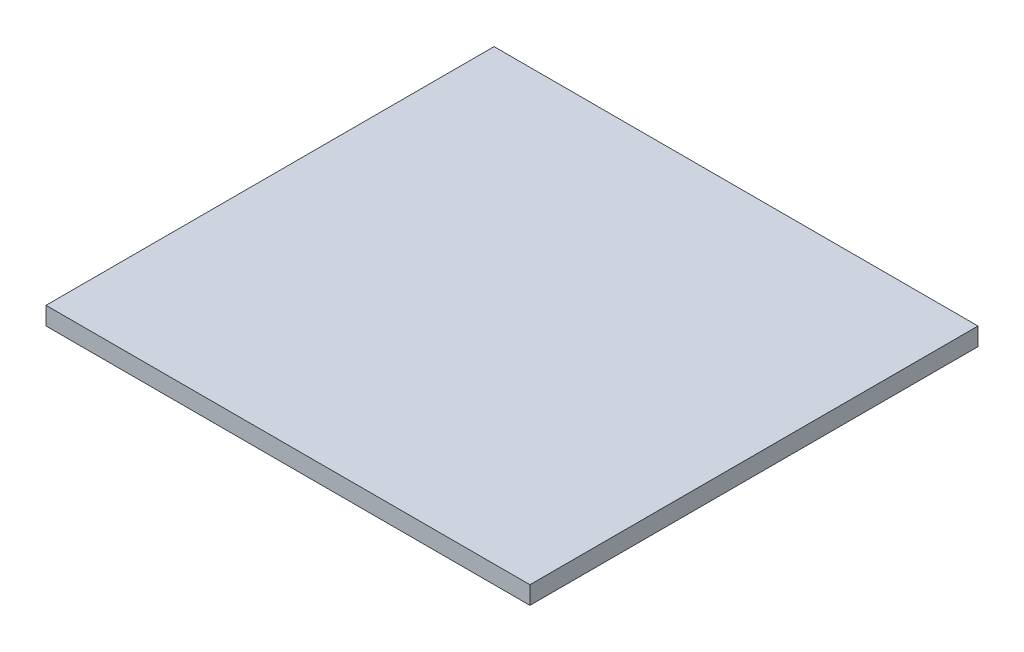
ISO-10303-21;
HEADER;
FILE_DESCRIPTION(('STEP AP214'),'2;1');
FILE_NAME('part.step','',(''),(''),'','','');
FILE_SCHEMA(('AUTOMOTIVE_DESIGN { 1 0 10303 214 1 1 1 1 }'));
ENDSEC;
DATA;
#1=APPLICATION_CONTEXT('core data for automotive mechanical design processes');
#2=APPLICATION_PROTOCOL_DEFINITION('international standard','automotive_design',2000,#1);
#3=PRODUCT_CONTEXT('',#1,'mechanical');
#4=PRODUCT('Part','Part','',(#3));
#5=PRODUCT_RELATED_PRODUCT_CATEGORY('part','',(#4));
#6=PRODUCT_DEFINITION_FORMATION('','',#4);
#7=PRODUCT_DEFINITION_CONTEXT('part definition',#1,'design');
#8=PRODUCT_DEFINITION('design','',#6,#7);
#9=PRODUCT_DEFINITION_SHAPE('','',#8);
#10=(LENGTH_UNIT() NAMED_UNIT(*) SI_UNIT(.MILLI.,.METRE.));
#11=(NAMED_UNIT(*) PLANE_ANGLE_UNIT() SI_UNIT($,.RADIAN.));
#12=(NAMED_UNIT(*) SI_UNIT($,.STERADIAN.) SOLID_ANGLE_UNIT());
#13=UNCERTAINTY_MEASURE_WITH_UNIT(LENGTH_MEASURE(1.E-05),#10,'distance_accuracy_value','');
#14=(GEOMETRIC_REPRESENTATION_CONTEXT(3) GLOBAL_UNCERTAINTY_ASSIGNED_CONTEXT((#13)) GLOBAL_UNIT_ASSIGNED_CONTEXT((#10,
#11,#12)) REPRESENTATION_CONTEXT('',''));
#15=CARTESIAN_POINT('',(0.,0.,0.));
#16=DIRECTION('',(0.,0.,1.));
#17=DIRECTION('',(1.,0.,0.));
#18=AXIS2_PLACEMENT_3D('',#15,#16,#17);
#19=CARTESIAN_POINT('',(0.,2.,0.));
#20=DIRECTION('',(1.,0.,0.));
#21=DIRECTION('',(0.,0.,-1.));
#22=AXIS2_PLACEMENT_3D('',#19,#20,#21);
#23=PLANE('',#22);
#24=DIRECTION('',(0.,0.,1.));
#25=VECTOR('',#24,1.);
#26=CARTESIAN_POINT('',(0.,0.,0.));
#27=LINE('',#26,#25);
#28=CARTESIAN_POINT('',(0.,0.,-50.));
#29=VERTEX_POINT('',#28);
#30=CARTESIAN_POINT('',(0.,0.,0.));
#31=VERTEX_POINT('',#30);
#32=EDGE_CURVE('E96',#29,#31,#27,.T.);
#33=ORIENTED_EDGE('',*,*,#32,.T.);
#34=DIRECTION('',(0.,-1.,0.));
#35=VECTOR('',#34,1.);
#36=CARTESIAN_POINT('',(0.,2.,0.));
#37=LINE('',#36,#35);
#38=CARTESIAN_POINT('',(0.,2.,0.));
#39=VERTEX_POINT('',#38);
#40=EDGE_CURVE('E11',#39,#31,#37,.T.);
#41=ORIENTED_EDGE('',*,*,#40,.F.);
#42=DIRECTION('',(0.,0.,1.));
#43=VECTOR('',#42,1.);
#44=CARTESIAN_POINT('',(0.,2.,0.));
#45=LINE('',#44,#43);
#46=CARTESIAN_POINT('',(0.,2.,-50.));
#47=VERTEX_POINT('',#46);
#48=EDGE_CURVE('E84',#47,#39,#45,.T.);
#49=ORIENTED_EDGE('',*,*,#48,.F.);
#50=DIRECTION('',(0.,-1.,0.));
#51=VECTOR('',#50,1.);
#52=CARTESIAN_POINT('',(0.,2.,-50.));
#53=LINE('',#52,#51);
#54=EDGE_CURVE('E92',#47,#29,#53,.T.);
#55=ORIENTED_EDGE('',*,*,#54,.T.);
#56=EDGE_LOOP('',(#33,#41,#49,#55));
#57=FACE_BOUND('',#56,.T.);
#58=ADVANCED_FACE('F33',(#57),#23,.F.);
#59=CARTESIAN_POINT('',(0.,2.,0.));
#60=DIRECTION('',(0.,0.,-1.));
#61=DIRECTION('',(-1.,0.,0.));
#62=AXIS2_PLACEMENT_3D('',#59,#60,#61);
#63=PLANE('',#62);
#64=DIRECTION('',(1.,0.,0.));
#65=VECTOR('',#64,1.);
#66=CARTESIAN_POINT('',(0.,0.,0.));
#67=LINE('',#66,#65);
#68=CARTESIAN_POINT('',(54.,0.,0.));
#69=VERTEX_POINT('',#68);
#70=EDGE_CURVE('E88',#31,#69,#67,.T.);
#71=ORIENTED_EDGE('',*,*,#70,.T.);
#72=DIRECTION('',(0.,-1.,0.));
#73=VECTOR('',#72,1.);
#74=CARTESIAN_POINT('',(54.,2.,0.));
#75=LINE('',#74,#73);
#76=CARTESIAN_POINT('',(54.,2.,0.));
#77=VERTEX_POINT('',#76);
#78=EDGE_CURVE('E41',#77,#69,#75,.T.);
#79=ORIENTED_EDGE('',*,*,#78,.F.);
#80=DIRECTION('',(1.,0.,0.));
#81=VECTOR('',#80,1.);
#82=CARTESIAN_POINT('',(0.,2.,0.));
#83=LINE('',#82,#81);
#84=EDGE_CURVE('E79',#39,#77,#83,.T.);
#85=ORIENTED_EDGE('',*,*,#84,.F.);
#86=ORIENTED_EDGE('',*,*,#40,.T.);
#87=EDGE_LOOP('',(#71,#79,#85,#86));
#88=FACE_BOUND('',#87,.T.);
#89=ADVANCED_FACE('F87',(#88),#63,.F.);
#90=CARTESIAN_POINT('',(54.,2.,0.));
#91=DIRECTION('',(-1.,0.,0.));
#92=DIRECTION('',(0.,0.,1.));
#93=AXIS2_PLACEMENT_3D('',#90,#91,#92);
#94=PLANE('',#93);
#95=DIRECTION('',(0.,0.,-1.));
#96=VECTOR('',#95,1.);
#97=CARTESIAN_POINT('',(54.,0.,0.));
#98=LINE('',#97,#96);
#99=CARTESIAN_POINT('',(54.,0.,-50.));
#100=VERTEX_POINT('',#99);
#101=EDGE_CURVE('E66',#69,#100,#98,.T.);
#102=ORIENTED_EDGE('',*,*,#101,.T.);
#103=DIRECTION('',(0.,-1.,0.));
#104=VECTOR('',#103,1.);
#105=CARTESIAN_POINT('',(54.,2.,-50.));
#106=LINE('',#105,#104);
#107=CARTESIAN_POINT('',(54.,2.,-50.));
#108=VERTEX_POINT('',#107);
#109=EDGE_CURVE('E89',#108,#100,#106,.T.);
#110=ORIENTED_EDGE('',*,*,#109,.F.);
#111=DIRECTION('',(0.,0.,-1.));
#112=VECTOR('',#111,1.);
#113=CARTESIAN_POINT('',(54.,2.,0.));
#114=LINE('',#113,#112);
#115=EDGE_CURVE('E82',#77,#108,#114,.T.);
#116=ORIENTED_EDGE('',*,*,#115,.F.);
#117=ORIENTED_EDGE('',*,*,#78,.T.);
#118=EDGE_LOOP('',(#102,#110,#116,#117));
#119=FACE_BOUND('',#118,.T.);
#120=ADVANCED_FACE('F90',(#119),#94,.F.);
#121=CARTESIAN_POINT('',(0.,2.,-50.));
#122=DIRECTION('',(0.,0.,1.));
#123=DIRECTION('',(1.,0.,0.));
#124=AXIS2_PLACEMENT_3D('',#121,#122,#123);
#125=PLANE('',#124);
#126=DIRECTION('',(-1.,0.,0.));
#127=VECTOR('',#126,1.);
#128=CARTESIAN_POINT('',(0.,0.,-50.));
#129=LINE('',#128,#127);
#130=EDGE_CURVE('E72',#100,#29,#129,.T.);
#131=ORIENTED_EDGE('',*,*,#130,.T.);
#132=ORIENTED_EDGE('',*,*,#54,.F.);
#133=DIRECTION('',(-1.,0.,0.));
#134=VECTOR('',#133,1.);
#135=CARTESIAN_POINT('',(0.,2.,-50.));
#136=LINE('',#135,#134);
#137=EDGE_CURVE('E49',#108,#47,#136,.T.);
#138=ORIENTED_EDGE('',*,*,#137,.F.);
#139=ORIENTED_EDGE('',*,*,#109,.T.);
#140=EDGE_LOOP('',(#131,#132,#138,#139));
#141=FACE_BOUND('',#140,.T.);
#142=ADVANCED_FACE('F103',(#141),#125,.F.);
#143=CARTESIAN_POINT('',(0.,2.,0.));
#144=DIRECTION('',(0.,-1.,0.));
#145=DIRECTION('',(0.,0.,-1.));
#146=AXIS2_PLACEMENT_3D('',#143,#144,#145);
#147=PLANE('',#146);
#148=ORIENTED_EDGE('',*,*,#48,.T.);
#149=ORIENTED_EDGE('',*,*,#84,.T.);
#150=ORIENTED_EDGE('',*,*,#115,.T.);
#151=ORIENTED_EDGE('',*,*,#137,.T.);
#152=EDGE_LOOP('',(#148,#149,#150,#151));
#153=FACE_BOUND('',#152,.T.);
#154=ADVANCED_FACE('F80',(#153),#147,.F.);
#155=CARTESIAN_POINT('',(0.,0.,0.));
#156=DIRECTION('',(0.,-1.,0.));
#157=DIRECTION('',(0.,0.,-1.));
#158=AXIS2_PLACEMENT_3D('',#155,#156,#157);
#159=PLANE('',#158);
#160=ORIENTED_EDGE('',*,*,#32,.F.);
#161=ORIENTED_EDGE('',*,*,#130,.F.);
#162=ORIENTED_EDGE('',*,*,#101,.F.);
#163=ORIENTED_EDGE('',*,*,#70,.F.);
#164=EDGE_LOOP('',(#160,#161,#162,#163));
#165=FACE_BOUND('',#164,.T.);
#166=ADVANCED_FACE('F106',(#165),#159,.T.);
#167=CLOSED_SHELL('',(#58,#89,#120,#142,#154,#166));
#168=MANIFOLD_SOLID_BREP('B2',#167);
#169=ADVANCED_BREP_SHAPE_REPRESENTATION('',(#18,#168),#14);
#170=SHAPE_DEFINITION_REPRESENTATION(#9,#169);
ENDSEC;
END-ISO-10303-21;
